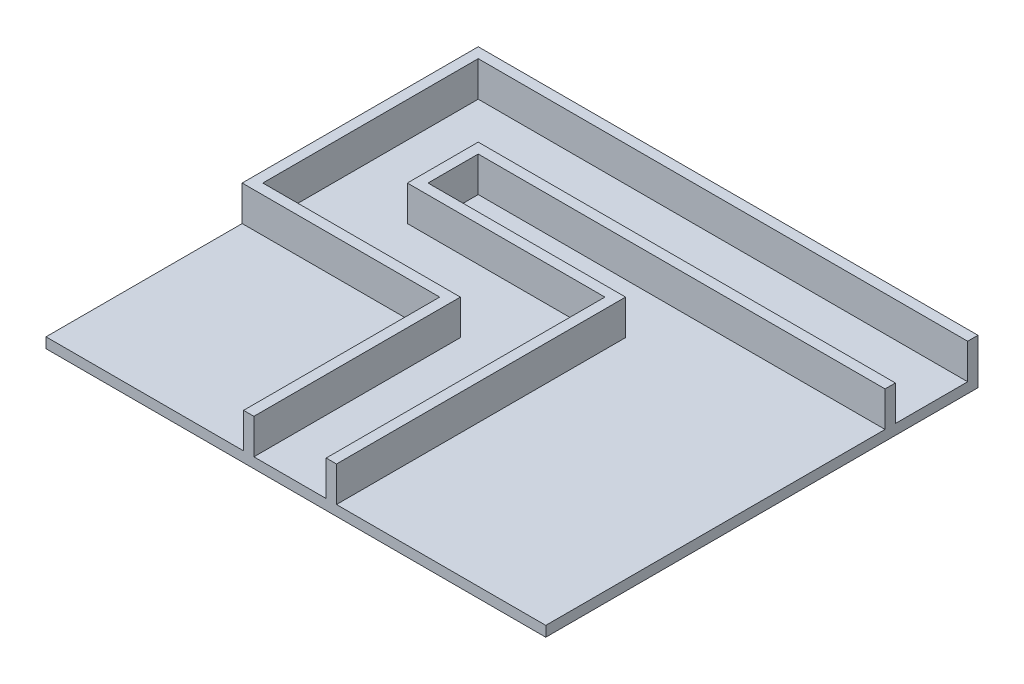
ISO-10303-21;
HEADER;
FILE_DESCRIPTION(('STEP AP214'),'2;1');
FILE_NAME('part.step','',(''),(''),'','','');
FILE_SCHEMA(('AUTOMOTIVE_DESIGN { 1 0 10303 214 1 1 1 1 }'));
ENDSEC;
DATA;
#1=APPLICATION_CONTEXT('core data for automotive mechanical design processes');
#2=APPLICATION_PROTOCOL_DEFINITION('international standard','automotive_design',2000,#1);
#3=PRODUCT_CONTEXT('',#1,'mechanical');
#4=PRODUCT('Part','Part','',(#3));
#5=PRODUCT_RELATED_PRODUCT_CATEGORY('part','',(#4));
#6=PRODUCT_DEFINITION_FORMATION('','',#4);
#7=PRODUCT_DEFINITION_CONTEXT('part definition',#1,'design');
#8=PRODUCT_DEFINITION('design','',#6,#7);
#9=PRODUCT_DEFINITION_SHAPE('','',#8);
#10=(LENGTH_UNIT() NAMED_UNIT(*) SI_UNIT(.MILLI.,.METRE.));
#11=(NAMED_UNIT(*) PLANE_ANGLE_UNIT() SI_UNIT($,.RADIAN.));
#12=(NAMED_UNIT(*) SI_UNIT($,.STERADIAN.) SOLID_ANGLE_UNIT());
#13=UNCERTAINTY_MEASURE_WITH_UNIT(LENGTH_MEASURE(1.E-05),#10,'distance_accuracy_value','');
#14=(GEOMETRIC_REPRESENTATION_CONTEXT(3) GLOBAL_UNCERTAINTY_ASSIGNED_CONTEXT((#13)) GLOBAL_UNIT_ASSIGNED_CONTEXT((#10,
#11,#12)) REPRESENTATION_CONTEXT('',''));
#15=CARTESIAN_POINT('',(0.,0.,0.));
#16=DIRECTION('',(0.,0.,1.));
#17=DIRECTION('',(1.,0.,0.));
#18=AXIS2_PLACEMENT_3D('',#15,#16,#17);
#19=CARTESIAN_POINT('',(0.,0.,0.));
#20=DIRECTION('',(0.,-1.,0.));
#21=DIRECTION('',(0.,0.,-1.));
#22=AXIS2_PLACEMENT_3D('',#19,#20,#21);
#23=PLANE('',#22);
#24=DIRECTION('',(0.,0.,-1.));
#25=VECTOR('',#24,1.);
#26=CARTESIAN_POINT('',(142.546877397399,0.,1067.9012345679));
#27=LINE('',#26,#25);
#28=CARTESIAN_POINT('',(142.546877397399,0.,1067.9012345679));
#29=VERTEX_POINT('',#28);
#30=CARTESIAN_POINT('',(142.546877397399,0.,-332.098765432099));
#31=VERTEX_POINT('',#30);
#32=EDGE_CURVE('E580',#29,#31,#27,.T.);
#33=ORIENTED_EDGE('',*,*,#32,.F.);
#34=DIRECTION('',(-1.,0.,0.));
#35=VECTOR('',#34,1.);
#36=CARTESIAN_POINT('',(-1264.24324605939,0.,1067.9012345679));
#37=LINE('',#36,#35);
#38=CARTESIAN_POINT('',(1156.12712431098,0.,1067.9012345679));
#39=VERTEX_POINT('',#38);
#40=EDGE_CURVE('E207',#39,#29,#37,.T.);
#41=ORIENTED_EDGE('',*,*,#40,.F.);
#42=DIRECTION('',(0.,0.,1.));
#43=VECTOR('',#42,1.);
#44=CARTESIAN_POINT('',(1156.12712431098,0.,1067.9012345679));
#45=LINE('',#44,#43);
#46=CARTESIAN_POINT('',(1156.12712431098,0.,-575.308641975309));
#47=VERTEX_POINT('',#46);
#48=EDGE_CURVE('E211',#47,#39,#45,.T.);
#49=ORIENTED_EDGE('',*,*,#48,.F.);
#50=DIRECTION('',(1.,0.,0.));
#51=VECTOR('',#50,1.);
#52=CARTESIAN_POINT('',(-814.243246059391,0.,-575.308641975309));
#53=LINE('',#52,#51);
#54=CARTESIAN_POINT('',(-814.243246059391,0.,-575.308641975309));
#55=VERTEX_POINT('',#54);
#56=EDGE_CURVE('E587',#55,#47,#53,.T.);
#57=ORIENTED_EDGE('',*,*,#56,.F.);
#58=DIRECTION('',(0.,0.,-1.));
#59=VECTOR('',#58,1.);
#60=CARTESIAN_POINT('',(-814.243246059391,0.,-332.098765432099));
#61=LINE('',#60,#59);
#62=CARTESIAN_POINT('',(-814.243246059391,0.,-332.098765432099));
#63=VERTEX_POINT('',#62);
#64=EDGE_CURVE('E55',#63,#55,#61,.T.);
#65=ORIENTED_EDGE('',*,*,#64,.F.);
#66=DIRECTION('',(-1.,0.,0.));
#67=VECTOR('',#66,1.);
#68=CARTESIAN_POINT('',(142.546877397399,0.,-332.098765432099));
#69=LINE('',#68,#67);
#70=EDGE_CURVE('E50',#31,#63,#69,.T.);
#71=ORIENTED_EDGE('',*,*,#70,.F.);
#72=EDGE_LOOP('',(#33,#41,#49,#57,#65,#71));
#73=FACE_BOUND('',#72,.T.);
#74=ADVANCED_FACE('F35',(#73),#23,.F.);
#75=DIRECTION('',(-1.,0.,0.));
#76=VECTOR('',#75,1.);
#77=CARTESIAN_POINT('',(-864.243246059391,0.,-625.308641975309));
#78=LINE('',#77,#76);
#79=CARTESIAN_POINT('',(1156.12712431098,0.,-625.308641975309));
#80=VERTEX_POINT('',#79);
#81=CARTESIAN_POINT('',(-864.243246059391,0.,-625.308641975309));
#82=VERTEX_POINT('',#81);
#83=EDGE_CURVE('E589',#80,#82,#78,.T.);
#84=ORIENTED_EDGE('',*,*,#83,.F.);
#85=CARTESIAN_POINT('',(1156.12712431098,0.,-975.308641975309));
#86=VERTEX_POINT('',#85);
#87=EDGE_CURVE('E228',#86,#80,#45,.T.);
#88=ORIENTED_EDGE('',*,*,#87,.F.);
#89=DIRECTION('',(1.,0.,0.));
#90=VECTOR('',#89,1.);
#91=CARTESIAN_POINT('',(-1214.24324605939,0.,-975.308641975309));
#92=LINE('',#91,#90);
#93=CARTESIAN_POINT('',(-1214.24324605939,0.,-975.308641975309));
#94=VERTEX_POINT('',#93);
#95=EDGE_CURVE('E270',#94,#86,#92,.T.);
#96=ORIENTED_EDGE('',*,*,#95,.F.);
#97=DIRECTION('',(0.,0.,-1.));
#98=VECTOR('',#97,1.);
#99=CARTESIAN_POINT('',(-1214.24324605939,0.,67.9012345679012));
#100=LINE('',#99,#98);
#101=CARTESIAN_POINT('',(-1214.24324605939,0.,67.9012345679012));
#102=VERTEX_POINT('',#101);
#103=EDGE_CURVE('E267',#102,#94,#100,.T.);
#104=ORIENTED_EDGE('',*,*,#103,.F.);
#105=DIRECTION('',(-1.,0.,0.));
#106=VECTOR('',#105,1.);
#107=CARTESIAN_POINT('',(-257.453122602601,0.,67.9012345679012));
#108=LINE('',#107,#106);
#109=CARTESIAN_POINT('',(-257.453122602601,0.,67.9012345679012));
#110=VERTEX_POINT('',#109);
#111=EDGE_CURVE('E264',#110,#102,#108,.T.);
#112=ORIENTED_EDGE('',*,*,#111,.F.);
#113=DIRECTION('',(0.,0.,-1.));
#114=VECTOR('',#113,1.);
#115=CARTESIAN_POINT('',(-257.453122602601,0.,1067.9012345679));
#116=LINE('',#115,#114);
#117=CARTESIAN_POINT('',(-257.453122602601,0.,1067.9012345679));
#118=VERTEX_POINT('',#117);
#119=EDGE_CURVE('E238',#118,#110,#116,.T.);
#120=ORIENTED_EDGE('',*,*,#119,.F.);
#121=CARTESIAN_POINT('',(92.5468773973993,0.,1067.9012345679));
#122=VERTEX_POINT('',#121);
#123=EDGE_CURVE('E233',#122,#118,#37,.T.);
#124=ORIENTED_EDGE('',*,*,#123,.F.);
#125=DIRECTION('',(0.,0.,1.));
#126=VECTOR('',#125,1.);
#127=CARTESIAN_POINT('',(92.5468773973993,0.,1067.9012345679));
#128=LINE('',#127,#126);
#129=CARTESIAN_POINT('',(92.5468773973993,0.,-282.098765432099));
#130=VERTEX_POINT('',#129);
#131=EDGE_CURVE('E201',#130,#122,#128,.T.);
#132=ORIENTED_EDGE('',*,*,#131,.F.);
#133=DIRECTION('',(1.,0.,0.));
#134=VECTOR('',#133,1.);
#135=CARTESIAN_POINT('',(92.5468773973993,0.,-282.098765432099));
#136=LINE('',#135,#134);
#137=CARTESIAN_POINT('',(-864.243246059391,0.,-282.098765432099));
#138=VERTEX_POINT('',#137);
#139=EDGE_CURVE('E595',#138,#130,#136,.T.);
#140=ORIENTED_EDGE('',*,*,#139,.F.);
#141=DIRECTION('',(0.,0.,1.));
#142=VECTOR('',#141,1.);
#143=CARTESIAN_POINT('',(-864.243246059391,0.,-282.098765432099));
#144=LINE('',#143,#142);
#145=EDGE_CURVE('E592',#82,#138,#144,.T.);
#146=ORIENTED_EDGE('',*,*,#145,.F.);
#147=EDGE_LOOP('',(#84,#88,#96,#104,#112,#120,#124,#132,#140,#146));
#148=FACE_BOUND('',#147,.T.);
#149=ADVANCED_FACE('F308',(#148),#23,.F.);
#150=CARTESIAN_POINT('',(-257.453122602601,170.,1067.9012345679));
#151=DIRECTION('',(0.,0.,-1.));
#152=DIRECTION('',(-1.,0.,0.));
#153=AXIS2_PLACEMENT_3D('',#150,#151,#152);
#154=PLANE('',#153);
#155=DIRECTION('',(0.,-1.,0.));
#156=VECTOR('',#155,1.);
#157=CARTESIAN_POINT('',(-307.453122602601,170.,1067.9012345679));
#158=LINE('',#157,#156);
#159=CARTESIAN_POINT('',(-307.453122602601,170.,1067.9012345679));
#160=VERTEX_POINT('',#159);
#161=CARTESIAN_POINT('',(-307.453122602601,0.,1067.9012345679));
#162=VERTEX_POINT('',#161);
#163=EDGE_CURVE('E261',#160,#162,#158,.T.);
#164=ORIENTED_EDGE('',*,*,#163,.T.);
#165=CARTESIAN_POINT('',(-1264.24324605939,0.,1067.9012345679));
#166=VERTEX_POINT('',#165);
#167=EDGE_CURVE('E231',#162,#166,#37,.T.);
#168=ORIENTED_EDGE('',*,*,#167,.T.);
#169=DIRECTION('',(0.,1.,0.));
#170=VECTOR('',#169,1.);
#171=CARTESIAN_POINT('',(-1264.24324605939,-50.,1067.9012345679));
#172=LINE('',#171,#170);
#173=CARTESIAN_POINT('',(-1264.24324605939,-50.,1067.9012345679));
#174=VERTEX_POINT('',#173);
#175=EDGE_CURVE('E226',#174,#166,#172,.T.);
#176=ORIENTED_EDGE('',*,*,#175,.F.);
#177=DIRECTION('',(-1.,0.,0.));
#178=VECTOR('',#177,1.);
#179=CARTESIAN_POINT('',(-1264.24324605939,-50.,1067.9012345679));
#180=LINE('',#179,#178);
#181=CARTESIAN_POINT('',(1156.12712431098,-50.,1067.9012345679));
#182=VERTEX_POINT('',#181);
#183=EDGE_CURVE('E225',#182,#174,#180,.T.);
#184=ORIENTED_EDGE('',*,*,#183,.F.);
#185=DIRECTION('',(0.,1.,0.));
#186=VECTOR('',#185,1.);
#187=CARTESIAN_POINT('',(1156.12712431098,-50.,1067.9012345679));
#188=LINE('',#187,#186);
#189=EDGE_CURVE('E236',#182,#39,#188,.T.);
#190=ORIENTED_EDGE('',*,*,#189,.T.);
#191=ORIENTED_EDGE('',*,*,#40,.T.);
#192=DIRECTION('',(0.,-1.,0.));
#193=VECTOR('',#192,1.);
#194=CARTESIAN_POINT('',(142.546877397399,170.,1067.9012345679));
#195=LINE('',#194,#193);
#196=CARTESIAN_POINT('',(142.546877397399,170.,1067.9012345679));
#197=VERTEX_POINT('',#196);
#198=EDGE_CURVE('E186',#197,#29,#195,.T.);
#199=ORIENTED_EDGE('',*,*,#198,.F.);
#200=DIRECTION('',(1.,0.,0.));
#201=VECTOR('',#200,1.);
#202=CARTESIAN_POINT('',(142.546877397399,170.,1067.9012345679));
#203=LINE('',#202,#201);
#204=CARTESIAN_POINT('',(92.5468773973993,170.,1067.9012345679));
#205=VERTEX_POINT('',#204);
#206=EDGE_CURVE('E192',#205,#197,#203,.T.);
#207=ORIENTED_EDGE('',*,*,#206,.F.);
#208=DIRECTION('',(0.,-1.,0.));
#209=VECTOR('',#208,1.);
#210=CARTESIAN_POINT('',(92.5468773973993,170.,1067.9012345679));
#211=LINE('',#210,#209);
#212=EDGE_CURVE('E325',#205,#122,#211,.T.);
#213=ORIENTED_EDGE('',*,*,#212,.T.);
#214=ORIENTED_EDGE('',*,*,#123,.T.);
#215=DIRECTION('',(0.,-1.,0.));
#216=VECTOR('',#215,1.);
#217=CARTESIAN_POINT('',(-257.453122602601,170.,1067.9012345679));
#218=LINE('',#217,#216);
#219=CARTESIAN_POINT('',(-257.453122602601,170.,1067.9012345679));
#220=VERTEX_POINT('',#219);
#221=EDGE_CURVE('E11',#220,#118,#218,.T.);
#222=ORIENTED_EDGE('',*,*,#221,.F.);
#223=DIRECTION('',(1.,0.,0.));
#224=VECTOR('',#223,1.);
#225=CARTESIAN_POINT('',(-257.453122602601,170.,1067.9012345679));
#226=LINE('',#225,#224);
#227=EDGE_CURVE('E239',#160,#220,#226,.T.);
#228=ORIENTED_EDGE('',*,*,#227,.F.);
#229=EDGE_LOOP('',(#164,#168,#176,#184,#190,#191,#199,#207,#213,#214,#222,#228));
#230=FACE_BOUND('',#229,.T.);
#231=ADVANCED_FACE('F37',(#230),#154,.F.);
#232=CARTESIAN_POINT('',(-257.453122602601,170.,1067.9012345679));
#233=DIRECTION('',(-1.,0.,0.));
#234=DIRECTION('',(0.,0.,1.));
#235=AXIS2_PLACEMENT_3D('',#232,#233,#234);
#236=PLANE('',#235);
#237=ORIENTED_EDGE('',*,*,#119,.T.);
#238=DIRECTION('',(0.,-1.,0.));
#239=VECTOR('',#238,1.);
#240=CARTESIAN_POINT('',(-257.453122602601,170.,67.9012345679012));
#241=LINE('',#240,#239);
#242=CARTESIAN_POINT('',(-257.453122602601,170.,67.9012345679012));
#243=VERTEX_POINT('',#242);
#244=EDGE_CURVE('E43',#243,#110,#241,.T.);
#245=ORIENTED_EDGE('',*,*,#244,.F.);
#246=DIRECTION('',(0.,0.,-1.));
#247=VECTOR('',#246,1.);
#248=CARTESIAN_POINT('',(-257.453122602601,170.,1067.9012345679));
#249=LINE('',#248,#247);
#250=EDGE_CURVE('E242',#220,#243,#249,.T.);
#251=ORIENTED_EDGE('',*,*,#250,.F.);
#252=ORIENTED_EDGE('',*,*,#221,.T.);
#253=EDGE_LOOP('',(#237,#245,#251,#252));
#254=FACE_BOUND('',#253,.T.);
#255=ADVANCED_FACE('F304',(#254),#236,.F.);
#256=CARTESIAN_POINT('',(-257.453122602601,170.,67.9012345679012));
#257=DIRECTION('',(0.,0.,1.));
#258=DIRECTION('',(1.,0.,0.));
#259=AXIS2_PLACEMENT_3D('',#256,#257,#258);
#260=PLANE('',#259);
#261=ORIENTED_EDGE('',*,*,#111,.T.);
#262=DIRECTION('',(0.,-1.,0.));
#263=VECTOR('',#262,1.);
#264=CARTESIAN_POINT('',(-1214.24324605939,170.,67.9012345679012));
#265=LINE('',#264,#263);
#266=CARTESIAN_POINT('',(-1214.24324605939,170.,67.9012345679012));
#267=VERTEX_POINT('',#266);
#268=EDGE_CURVE('E295',#267,#102,#265,.T.);
#269=ORIENTED_EDGE('',*,*,#268,.F.);
#270=DIRECTION('',(-1.,0.,0.));
#271=VECTOR('',#270,1.);
#272=CARTESIAN_POINT('',(-257.453122602601,170.,67.9012345679012));
#273=LINE('',#272,#271);
#274=EDGE_CURVE('E245',#243,#267,#273,.T.);
#275=ORIENTED_EDGE('',*,*,#274,.F.);
#276=ORIENTED_EDGE('',*,*,#244,.T.);
#277=EDGE_LOOP('',(#261,#269,#275,#276));
#278=FACE_BOUND('',#277,.T.);
#279=ADVANCED_FACE('F301',(#278),#260,.F.);
#280=CARTESIAN_POINT('',(-1214.24324605939,170.,67.9012345679012));
#281=DIRECTION('',(-1.,0.,0.));
#282=DIRECTION('',(0.,0.,1.));
#283=AXIS2_PLACEMENT_3D('',#280,#281,#282);
#284=PLANE('',#283);
#285=ORIENTED_EDGE('',*,*,#103,.T.);
#286=DIRECTION('',(0.,-1.,0.));
#287=VECTOR('',#286,1.);
#288=CARTESIAN_POINT('',(-1214.24324605939,170.,-975.308641975309));
#289=LINE('',#288,#287);
#290=CARTESIAN_POINT('',(-1214.24324605939,170.,-975.308641975309));
#291=VERTEX_POINT('',#290);
#292=EDGE_CURVE('E292',#291,#94,#289,.T.);
#293=ORIENTED_EDGE('',*,*,#292,.F.);
#294=DIRECTION('',(0.,0.,-1.));
#295=VECTOR('',#294,1.);
#296=CARTESIAN_POINT('',(-1214.24324605939,170.,67.9012345679012));
#297=LINE('',#296,#295);
#298=EDGE_CURVE('E247',#267,#291,#297,.T.);
#299=ORIENTED_EDGE('',*,*,#298,.F.);
#300=ORIENTED_EDGE('',*,*,#268,.T.);
#301=EDGE_LOOP('',(#285,#293,#299,#300));
#302=FACE_BOUND('',#301,.T.);
#303=ADVANCED_FACE('F312',(#302),#284,.F.);
#304=CARTESIAN_POINT('',(-1214.24324605939,170.,-975.308641975309));
#305=DIRECTION('',(0.,0.,-1.));
#306=DIRECTION('',(-1.,0.,0.));
#307=AXIS2_PLACEMENT_3D('',#304,#305,#306);
#308=PLANE('',#307);
#309=ORIENTED_EDGE('',*,*,#95,.T.);
#310=DIRECTION('',(0.,-1.,0.));
#311=VECTOR('',#310,1.);
#312=CARTESIAN_POINT('',(1156.12712431098,170.,-975.308641975309));
#313=LINE('',#312,#311);
#314=CARTESIAN_POINT('',(1156.12712431098,170.,-975.308641975309));
#315=VERTEX_POINT('',#314);
#316=EDGE_CURVE('E289',#315,#86,#313,.T.);
#317=ORIENTED_EDGE('',*,*,#316,.F.);
#318=DIRECTION('',(1.,0.,0.));
#319=VECTOR('',#318,1.);
#320=CARTESIAN_POINT('',(-1214.24324605939,170.,-975.308641975309));
#321=LINE('',#320,#319);
#322=EDGE_CURVE('E249',#291,#315,#321,.T.);
#323=ORIENTED_EDGE('',*,*,#322,.F.);
#324=ORIENTED_EDGE('',*,*,#292,.T.);
#325=EDGE_LOOP('',(#309,#317,#323,#324));
#326=FACE_BOUND('',#325,.T.);
#327=ADVANCED_FACE('F316',(#326),#308,.F.);
#328=CARTESIAN_POINT('',(1156.12712431098,170.,-975.308641975309));
#329=DIRECTION('',(-1.,0.,0.));
#330=DIRECTION('',(0.,0.,1.));
#331=AXIS2_PLACEMENT_3D('',#328,#329,#330);
#332=PLANE('',#331);
#333=ORIENTED_EDGE('',*,*,#316,.T.);
#334=ORIENTED_EDGE('',*,*,#87,.T.);
#335=DIRECTION('',(0.,-1.,0.));
#336=VECTOR('',#335,1.);
#337=CARTESIAN_POINT('',(1156.12712431098,170.,-625.308641975309));
#338=LINE('',#337,#336);
#339=CARTESIAN_POINT('',(1156.12712431098,170.,-625.308641975309));
#340=VERTEX_POINT('',#339);
#341=EDGE_CURVE('E609',#340,#80,#338,.T.);
#342=ORIENTED_EDGE('',*,*,#341,.F.);
#343=DIRECTION('',(0.,0.,-1.));
#344=VECTOR('',#343,1.);
#345=CARTESIAN_POINT('',(1156.12712431098,170.,-575.308641975309));
#346=LINE('',#345,#344);
#347=CARTESIAN_POINT('',(1156.12712431098,170.,-575.308641975309));
#348=VERTEX_POINT('',#347);
#349=EDGE_CURVE('E626',#348,#340,#346,.T.);
#350=ORIENTED_EDGE('',*,*,#349,.F.);
#351=DIRECTION('',(0.,-1.,0.));
#352=VECTOR('',#351,1.);
#353=CARTESIAN_POINT('',(1156.12712431098,170.,-575.308641975309));
#354=LINE('',#353,#352);
#355=EDGE_CURVE('E611',#348,#47,#354,.T.);
#356=ORIENTED_EDGE('',*,*,#355,.T.);
#357=ORIENTED_EDGE('',*,*,#48,.T.);
#358=ORIENTED_EDGE('',*,*,#189,.F.);
#359=DIRECTION('',(0.,0.,1.));
#360=VECTOR('',#359,1.);
#361=CARTESIAN_POINT('',(1156.12712431098,-50.,1067.9012345679));
#362=LINE('',#361,#360);
#363=CARTESIAN_POINT('',(1156.12712431098,-50.,-1025.30864197531));
#364=VERTEX_POINT('',#363);
#365=EDGE_CURVE('E223',#364,#182,#362,.T.);
#366=ORIENTED_EDGE('',*,*,#365,.F.);
#367=DIRECTION('',(0.,-1.,0.));
#368=VECTOR('',#367,1.);
#369=CARTESIAN_POINT('',(1156.12712431098,170.,-1025.30864197531));
#370=LINE('',#369,#368);
#371=CARTESIAN_POINT('',(1156.12712431098,170.,-1025.30864197531));
#372=VERTEX_POINT('',#371);
#373=EDGE_CURVE('E287',#372,#364,#370,.T.);
#374=ORIENTED_EDGE('',*,*,#373,.F.);
#375=DIRECTION('',(0.,0.,-1.));
#376=VECTOR('',#375,1.);
#377=CARTESIAN_POINT('',(1156.12712431098,170.,-975.308641975309));
#378=LINE('',#377,#376);
#379=EDGE_CURVE('E251',#315,#372,#378,.T.);
#380=ORIENTED_EDGE('',*,*,#379,.F.);
#381=EDGE_LOOP('',(#333,#334,#342,#350,#356,#357,#358,#366,#374,#380));
#382=FACE_BOUND('',#381,.T.);
#383=ADVANCED_FACE('F468',(#382),#332,.F.);
#384=CARTESIAN_POINT('',(-1264.24324605939,170.,-1025.30864197531));
#385=DIRECTION('',(0.,0.,1.));
#386=DIRECTION('',(1.,0.,0.));
#387=AXIS2_PLACEMENT_3D('',#384,#385,#386);
#388=PLANE('',#387);
#389=ORIENTED_EDGE('',*,*,#373,.T.);
#390=DIRECTION('',(1.,0.,0.));
#391=VECTOR('',#390,1.);
#392=CARTESIAN_POINT('',(-1264.24324605939,-50.,-1025.30864197531));
#393=LINE('',#392,#391);
#394=CARTESIAN_POINT('',(-1264.24324605939,-50.,-1025.30864197531));
#395=VERTEX_POINT('',#394);
#396=EDGE_CURVE('E220',#395,#364,#393,.T.);
#397=ORIENTED_EDGE('',*,*,#396,.F.);
#398=DIRECTION('',(0.,-1.,0.));
#399=VECTOR('',#398,1.);
#400=CARTESIAN_POINT('',(-1264.24324605939,170.,-1025.30864197531));
#401=LINE('',#400,#399);
#402=CARTESIAN_POINT('',(-1264.24324605939,170.,-1025.30864197531));
#403=VERTEX_POINT('',#402);
#404=EDGE_CURVE('E285',#403,#395,#401,.T.);
#405=ORIENTED_EDGE('',*,*,#404,.F.);
#406=DIRECTION('',(-1.,0.,0.));
#407=VECTOR('',#406,1.);
#408=CARTESIAN_POINT('',(-1264.24324605939,170.,-1025.30864197531));
#409=LINE('',#408,#407);
#410=EDGE_CURVE('E253',#372,#403,#409,.T.);
#411=ORIENTED_EDGE('',*,*,#410,.F.);
#412=EDGE_LOOP('',(#389,#397,#405,#411));
#413=FACE_BOUND('',#412,.T.);
#414=ADVANCED_FACE('F459',(#413),#388,.F.);
#415=CARTESIAN_POINT('',(-1264.24324605939,170.,117.901234567901));
#416=DIRECTION('',(1.,0.,0.));
#417=DIRECTION('',(0.,0.,-1.));
#418=AXIS2_PLACEMENT_3D('',#415,#416,#417);
#419=PLANE('',#418);
#420=ORIENTED_EDGE('',*,*,#404,.T.);
#421=DIRECTION('',(0.,0.,-1.));
#422=VECTOR('',#421,1.);
#423=CARTESIAN_POINT('',(-1264.24324605939,-50.,1067.9012345679));
#424=LINE('',#423,#422);
#425=EDGE_CURVE('E217',#174,#395,#424,.T.);
#426=ORIENTED_EDGE('',*,*,#425,.F.);
#427=ORIENTED_EDGE('',*,*,#175,.T.);
#428=DIRECTION('',(0.,0.,-1.));
#429=VECTOR('',#428,1.);
#430=CARTESIAN_POINT('',(-1264.24324605939,0.,1067.9012345679));
#431=LINE('',#430,#429);
#432=CARTESIAN_POINT('',(-1264.24324605939,0.,117.901234567901));
#433=VERTEX_POINT('',#432);
#434=EDGE_CURVE('E208',#166,#433,#431,.T.);
#435=ORIENTED_EDGE('',*,*,#434,.T.);
#436=DIRECTION('',(0.,-1.,0.));
#437=VECTOR('',#436,1.);
#438=CARTESIAN_POINT('',(-1264.24324605939,170.,117.901234567901));
#439=LINE('',#438,#437);
#440=CARTESIAN_POINT('',(-1264.24324605939,170.,117.901234567901));
#441=VERTEX_POINT('',#440);
#442=EDGE_CURVE('E282',#441,#433,#439,.T.);
#443=ORIENTED_EDGE('',*,*,#442,.F.);
#444=DIRECTION('',(0.,0.,1.));
#445=VECTOR('',#444,1.);
#446=CARTESIAN_POINT('',(-1264.24324605939,170.,117.901234567901));
#447=LINE('',#446,#445);
#448=EDGE_CURVE('E255',#403,#441,#447,.T.);
#449=ORIENTED_EDGE('',*,*,#448,.F.);
#450=EDGE_LOOP('',(#420,#426,#427,#435,#443,#449));
#451=FACE_BOUND('',#450,.T.);
#452=ADVANCED_FACE('F332',(#451),#419,.F.);
#453=CARTESIAN_POINT('',(-307.453122602601,170.,117.901234567901));
#454=DIRECTION('',(0.,0.,-1.));
#455=DIRECTION('',(-1.,0.,0.));
#456=AXIS2_PLACEMENT_3D('',#453,#454,#455);
#457=PLANE('',#456);
#458=DIRECTION('',(1.,0.,0.));
#459=VECTOR('',#458,1.);
#460=CARTESIAN_POINT('',(-307.453122602601,0.,117.901234567901));
#461=LINE('',#460,#459);
#462=CARTESIAN_POINT('',(-307.453122602601,0.,117.901234567901));
#463=VERTEX_POINT('',#462);
#464=EDGE_CURVE('E273',#433,#463,#461,.T.);
#465=ORIENTED_EDGE('',*,*,#464,.T.);
#466=DIRECTION('',(0.,-1.,0.));
#467=VECTOR('',#466,1.);
#468=CARTESIAN_POINT('',(-307.453122602601,170.,117.901234567901));
#469=LINE('',#468,#467);
#470=CARTESIAN_POINT('',(-307.453122602601,170.,117.901234567901));
#471=VERTEX_POINT('',#470);
#472=EDGE_CURVE('E279',#471,#463,#469,.T.);
#473=ORIENTED_EDGE('',*,*,#472,.F.);
#474=DIRECTION('',(1.,0.,0.));
#475=VECTOR('',#474,1.);
#476=CARTESIAN_POINT('',(-307.453122602601,170.,117.901234567901));
#477=LINE('',#476,#475);
#478=EDGE_CURVE('E257',#441,#471,#477,.T.);
#479=ORIENTED_EDGE('',*,*,#478,.F.);
#480=ORIENTED_EDGE('',*,*,#442,.T.);
#481=EDGE_LOOP('',(#465,#473,#479,#480));
#482=FACE_BOUND('',#481,.T.);
#483=ADVANCED_FACE('F337',(#482),#457,.F.);
#484=CARTESIAN_POINT('',(-307.453122602601,170.,1067.9012345679));
#485=DIRECTION('',(1.,0.,0.));
#486=DIRECTION('',(0.,0.,-1.));
#487=AXIS2_PLACEMENT_3D('',#484,#485,#486);
#488=PLANE('',#487);
#489=DIRECTION('',(0.,0.,1.));
#490=VECTOR('',#489,1.);
#491=CARTESIAN_POINT('',(-307.453122602601,0.,1067.9012345679));
#492=LINE('',#491,#490);
#493=EDGE_CURVE('E243',#463,#162,#492,.T.);
#494=ORIENTED_EDGE('',*,*,#493,.T.);
#495=ORIENTED_EDGE('',*,*,#163,.F.);
#496=DIRECTION('',(0.,0.,1.));
#497=VECTOR('',#496,1.);
#498=CARTESIAN_POINT('',(-307.453122602601,170.,1067.9012345679));
#499=LINE('',#498,#497);
#500=EDGE_CURVE('E259',#471,#160,#499,.T.);
#501=ORIENTED_EDGE('',*,*,#500,.F.);
#502=ORIENTED_EDGE('',*,*,#472,.T.);
#503=EDGE_LOOP('',(#494,#495,#501,#502));
#504=FACE_BOUND('',#503,.T.);
#505=ADVANCED_FACE('F340',(#504),#488,.F.);
#506=CARTESIAN_POINT('',(0.,170.,0.));
#507=DIRECTION('',(0.,-1.,0.));
#508=DIRECTION('',(0.,0.,-1.));
#509=AXIS2_PLACEMENT_3D('',#506,#507,#508);
#510=PLANE('',#509);
#511=ORIENTED_EDGE('',*,*,#227,.T.);
#512=ORIENTED_EDGE('',*,*,#250,.T.);
#513=ORIENTED_EDGE('',*,*,#274,.T.);
#514=ORIENTED_EDGE('',*,*,#298,.T.);
#515=ORIENTED_EDGE('',*,*,#322,.T.);
#516=ORIENTED_EDGE('',*,*,#379,.T.);
#517=ORIENTED_EDGE('',*,*,#410,.T.);
#518=ORIENTED_EDGE('',*,*,#448,.T.);
#519=ORIENTED_EDGE('',*,*,#478,.T.);
#520=ORIENTED_EDGE('',*,*,#500,.T.);
#521=EDGE_LOOP('',(#511,#512,#513,#514,#515,#516,#517,#518,#519,#520));
#522=FACE_BOUND('',#521,.T.);
#523=ADVANCED_FACE('F320',(#522),#510,.F.);
#524=ORIENTED_EDGE('',*,*,#493,.F.);
#525=ORIENTED_EDGE('',*,*,#464,.F.);
#526=ORIENTED_EDGE('',*,*,#434,.F.);
#527=ORIENTED_EDGE('',*,*,#167,.F.);
#528=EDGE_LOOP('',(#524,#525,#526,#527));
#529=FACE_BOUND('',#528,.T.);
#530=ADVANCED_FACE('F334',(#529),#23,.F.);
#531=CARTESIAN_POINT('',(0.,-50.,0.));
#532=DIRECTION('',(0.,-1.,0.));
#533=DIRECTION('',(0.,0.,-1.));
#534=AXIS2_PLACEMENT_3D('',#531,#532,#533);
#535=PLANE('',#534);
#536=ORIENTED_EDGE('',*,*,#425,.T.);
#537=ORIENTED_EDGE('',*,*,#396,.T.);
#538=ORIENTED_EDGE('',*,*,#365,.T.);
#539=ORIENTED_EDGE('',*,*,#183,.T.);
#540=EDGE_LOOP('',(#536,#537,#538,#539));
#541=FACE_BOUND('',#540,.T.);
#542=ADVANCED_FACE('F356',(#541),#535,.T.);
#543=CARTESIAN_POINT('',(142.546877397399,170.,1067.9012345679));
#544=DIRECTION('',(-1.,0.,0.));
#545=DIRECTION('',(0.,0.,1.));
#546=AXIS2_PLACEMENT_3D('',#543,#544,#545);
#547=PLANE('',#546);
#548=ORIENTED_EDGE('',*,*,#32,.T.);
#549=DIRECTION('',(0.,-1.,0.));
#550=VECTOR('',#549,1.);
#551=CARTESIAN_POINT('',(142.546877397399,170.,-332.098765432099));
#552=LINE('',#551,#550);
#553=CARTESIAN_POINT('',(142.546877397399,170.,-332.098765432099));
#554=VERTEX_POINT('',#553);
#555=EDGE_CURVE('E188',#554,#31,#552,.T.);
#556=ORIENTED_EDGE('',*,*,#555,.F.);
#557=DIRECTION('',(0.,0.,-1.));
#558=VECTOR('',#557,1.);
#559=CARTESIAN_POINT('',(142.546877397399,170.,1067.9012345679));
#560=LINE('',#559,#558);
#561=EDGE_CURVE('E182',#197,#554,#560,.T.);
#562=ORIENTED_EDGE('',*,*,#561,.F.);
#563=ORIENTED_EDGE('',*,*,#198,.T.);
#564=EDGE_LOOP('',(#548,#556,#562,#563));
#565=FACE_BOUND('',#564,.T.);
#566=ADVANCED_FACE('F184',(#565),#547,.F.);
#567=CARTESIAN_POINT('',(142.546877397399,170.,-332.098765432099));
#568=DIRECTION('',(0.,0.,1.));
#569=DIRECTION('',(1.,0.,0.));
#570=AXIS2_PLACEMENT_3D('',#567,#568,#569);
#571=PLANE('',#570);
#572=ORIENTED_EDGE('',*,*,#70,.T.);
#573=DIRECTION('',(0.,-1.,0.));
#574=VECTOR('',#573,1.);
#575=CARTESIAN_POINT('',(-814.243246059391,170.,-332.098765432099));
#576=LINE('',#575,#574);
#577=CARTESIAN_POINT('',(-814.243246059391,170.,-332.098765432099));
#578=VERTEX_POINT('',#577);
#579=EDGE_CURVE('E213',#578,#63,#576,.T.);
#580=ORIENTED_EDGE('',*,*,#579,.F.);
#581=DIRECTION('',(-1.,0.,0.));
#582=VECTOR('',#581,1.);
#583=CARTESIAN_POINT('',(142.546877397399,170.,-332.098765432099));
#584=LINE('',#583,#582);
#585=EDGE_CURVE('E191',#554,#578,#584,.T.);
#586=ORIENTED_EDGE('',*,*,#585,.F.);
#587=ORIENTED_EDGE('',*,*,#555,.T.);
#588=EDGE_LOOP('',(#572,#580,#586,#587));
#589=FACE_BOUND('',#588,.T.);
#590=ADVANCED_FACE('F364',(#589),#571,.F.);
#591=CARTESIAN_POINT('',(-814.243246059391,170.,-332.098765432099));
#592=DIRECTION('',(-1.,0.,0.));
#593=DIRECTION('',(0.,0.,1.));
#594=AXIS2_PLACEMENT_3D('',#591,#592,#593);
#595=PLANE('',#594);
#596=ORIENTED_EDGE('',*,*,#64,.T.);
#597=DIRECTION('',(0.,-1.,0.));
#598=VECTOR('',#597,1.);
#599=CARTESIAN_POINT('',(-814.243246059391,170.,-575.308641975309));
#600=LINE('',#599,#598);
#601=CARTESIAN_POINT('',(-814.243246059391,170.,-575.308641975309));
#602=VERTEX_POINT('',#601);
#603=EDGE_CURVE('E614',#602,#55,#600,.T.);
#604=ORIENTED_EDGE('',*,*,#603,.F.);
#605=DIRECTION('',(0.,0.,-1.));
#606=VECTOR('',#605,1.);
#607=CARTESIAN_POINT('',(-814.243246059391,170.,-332.098765432099));
#608=LINE('',#607,#606);
#609=EDGE_CURVE('E620',#578,#602,#608,.T.);
#610=ORIENTED_EDGE('',*,*,#609,.F.);
#611=ORIENTED_EDGE('',*,*,#579,.T.);
#612=EDGE_LOOP('',(#596,#604,#610,#611));
#613=FACE_BOUND('',#612,.T.);
#614=ADVANCED_FACE('F369',(#613),#595,.F.);
#615=CARTESIAN_POINT('',(-814.243246059391,170.,-575.308641975309));
#616=DIRECTION('',(0.,0.,-1.));
#617=DIRECTION('',(-1.,0.,0.));
#618=AXIS2_PLACEMENT_3D('',#615,#616,#617);
#619=PLANE('',#618);
#620=ORIENTED_EDGE('',*,*,#56,.T.);
#621=ORIENTED_EDGE('',*,*,#355,.F.);
#622=DIRECTION('',(1.,0.,0.));
#623=VECTOR('',#622,1.);
#624=CARTESIAN_POINT('',(-814.243246059391,170.,-575.308641975309));
#625=LINE('',#624,#623);
#626=EDGE_CURVE('E622',#602,#348,#625,.T.);
#627=ORIENTED_EDGE('',*,*,#626,.F.);
#628=ORIENTED_EDGE('',*,*,#603,.T.);
#629=EDGE_LOOP('',(#620,#621,#627,#628));
#630=FACE_BOUND('',#629,.T.);
#631=ADVANCED_FACE('F373',(#630),#619,.F.);
#632=CARTESIAN_POINT('',(-864.243246059391,170.,-625.308641975309));
#633=DIRECTION('',(0.,0.,1.));
#634=DIRECTION('',(1.,0.,0.));
#635=AXIS2_PLACEMENT_3D('',#632,#633,#634);
#636=PLANE('',#635);
#637=ORIENTED_EDGE('',*,*,#83,.T.);
#638=DIRECTION('',(0.,-1.,0.));
#639=VECTOR('',#638,1.);
#640=CARTESIAN_POINT('',(-864.243246059391,170.,-625.308641975309));
#641=LINE('',#640,#639);
#642=CARTESIAN_POINT('',(-864.243246059391,170.,-625.308641975309));
#643=VERTEX_POINT('',#642);
#644=EDGE_CURVE('E606',#643,#82,#641,.T.);
#645=ORIENTED_EDGE('',*,*,#644,.F.);
#646=DIRECTION('',(-1.,0.,0.));
#647=VECTOR('',#646,1.);
#648=CARTESIAN_POINT('',(-864.243246059391,170.,-625.308641975309));
#649=LINE('',#648,#647);
#650=EDGE_CURVE('E628',#340,#643,#649,.T.);
#651=ORIENTED_EDGE('',*,*,#650,.F.);
#652=ORIENTED_EDGE('',*,*,#341,.T.);
#653=EDGE_LOOP('',(#637,#645,#651,#652));
#654=FACE_BOUND('',#653,.T.);
#655=ADVANCED_FACE('F377',(#654),#636,.F.);
#656=CARTESIAN_POINT('',(-864.243246059391,170.,-282.098765432099));
#657=DIRECTION('',(1.,0.,0.));
#658=DIRECTION('',(0.,0.,-1.));
#659=AXIS2_PLACEMENT_3D('',#656,#657,#658);
#660=PLANE('',#659);
#661=ORIENTED_EDGE('',*,*,#145,.T.);
#662=DIRECTION('',(0.,-1.,0.));
#663=VECTOR('',#662,1.);
#664=CARTESIAN_POINT('',(-864.243246059391,170.,-282.098765432099));
#665=LINE('',#664,#663);
#666=CARTESIAN_POINT('',(-864.243246059391,170.,-282.098765432099));
#667=VERTEX_POINT('',#666);
#668=EDGE_CURVE('E603',#667,#138,#665,.T.);
#669=ORIENTED_EDGE('',*,*,#668,.F.);
#670=DIRECTION('',(0.,0.,1.));
#671=VECTOR('',#670,1.);
#672=CARTESIAN_POINT('',(-864.243246059391,170.,-282.098765432099));
#673=LINE('',#672,#671);
#674=EDGE_CURVE('E630',#643,#667,#673,.T.);
#675=ORIENTED_EDGE('',*,*,#674,.F.);
#676=ORIENTED_EDGE('',*,*,#644,.T.);
#677=EDGE_LOOP('',(#661,#669,#675,#676));
#678=FACE_BOUND('',#677,.T.);
#679=ADVANCED_FACE('F381',(#678),#660,.F.);
#680=CARTESIAN_POINT('',(92.5468773973993,170.,-282.098765432099));
#681=DIRECTION('',(0.,0.,-1.));
#682=DIRECTION('',(-1.,0.,0.));
#683=AXIS2_PLACEMENT_3D('',#680,#681,#682);
#684=PLANE('',#683);
#685=ORIENTED_EDGE('',*,*,#139,.T.);
#686=DIRECTION('',(0.,-1.,0.));
#687=VECTOR('',#686,1.);
#688=CARTESIAN_POINT('',(92.5468773973993,170.,-282.098765432099));
#689=LINE('',#688,#687);
#690=CARTESIAN_POINT('',(92.5468773973993,170.,-282.098765432099));
#691=VERTEX_POINT('',#690);
#692=EDGE_CURVE('E600',#691,#130,#689,.T.);
#693=ORIENTED_EDGE('',*,*,#692,.F.);
#694=DIRECTION('',(1.,0.,0.));
#695=VECTOR('',#694,1.);
#696=CARTESIAN_POINT('',(92.5468773973993,170.,-282.098765432099));
#697=LINE('',#696,#695);
#698=EDGE_CURVE('E631',#667,#691,#697,.T.);
#699=ORIENTED_EDGE('',*,*,#698,.F.);
#700=ORIENTED_EDGE('',*,*,#668,.T.);
#701=EDGE_LOOP('',(#685,#693,#699,#700));
#702=FACE_BOUND('',#701,.T.);
#703=ADVANCED_FACE('F385',(#702),#684,.F.);
#704=CARTESIAN_POINT('',(92.5468773973993,170.,1067.9012345679));
#705=DIRECTION('',(1.,0.,0.));
#706=DIRECTION('',(0.,0.,-1.));
#707=AXIS2_PLACEMENT_3D('',#704,#705,#706);
#708=PLANE('',#707);
#709=ORIENTED_EDGE('',*,*,#131,.T.);
#710=ORIENTED_EDGE('',*,*,#212,.F.);
#711=DIRECTION('',(0.,0.,1.));
#712=VECTOR('',#711,1.);
#713=CARTESIAN_POINT('',(92.5468773973993,170.,1067.9012345679));
#714=LINE('',#713,#712);
#715=EDGE_CURVE('E197',#691,#205,#714,.T.);
#716=ORIENTED_EDGE('',*,*,#715,.F.);
#717=ORIENTED_EDGE('',*,*,#692,.T.);
#718=EDGE_LOOP('',(#709,#710,#716,#717));
#719=FACE_BOUND('',#718,.T.);
#720=ADVANCED_FACE('F389',(#719),#708,.F.);
#721=CARTESIAN_POINT('',(0.,170.,0.));
#722=DIRECTION('',(0.,-1.,0.));
#723=DIRECTION('',(0.,0.,-1.));
#724=AXIS2_PLACEMENT_3D('',#721,#722,#723);
#725=PLANE('',#724);
#726=ORIENTED_EDGE('',*,*,#206,.T.);
#727=ORIENTED_EDGE('',*,*,#561,.T.);
#728=ORIENTED_EDGE('',*,*,#585,.T.);
#729=ORIENTED_EDGE('',*,*,#609,.T.);
#730=ORIENTED_EDGE('',*,*,#626,.T.);
#731=ORIENTED_EDGE('',*,*,#349,.T.);
#732=ORIENTED_EDGE('',*,*,#650,.T.);
#733=ORIENTED_EDGE('',*,*,#674,.T.);
#734=ORIENTED_EDGE('',*,*,#698,.T.);
#735=ORIENTED_EDGE('',*,*,#715,.T.);
#736=EDGE_LOOP('',(#726,#727,#728,#729,#730,#731,#732,#733,#734,#735));
#737=FACE_BOUND('',#736,.T.);
#738=ADVANCED_FACE('F195',(#737),#725,.F.);
#739=CLOSED_SHELL('',(#74,#149,#231,#255,#279,#303,#327,#383,#414,#452,#483,#505,#523,#530,#542,
#566,#590,#614,#631,#655,#679,#703,#720,#738));
#740=MANIFOLD_SOLID_BREP('B2',#739);
#741=ADVANCED_BREP_SHAPE_REPRESENTATION('',(#18,#740),#14);
#742=SHAPE_DEFINITION_REPRESENTATION(#9,#741);
ENDSEC;
END-ISO-10303-21;
